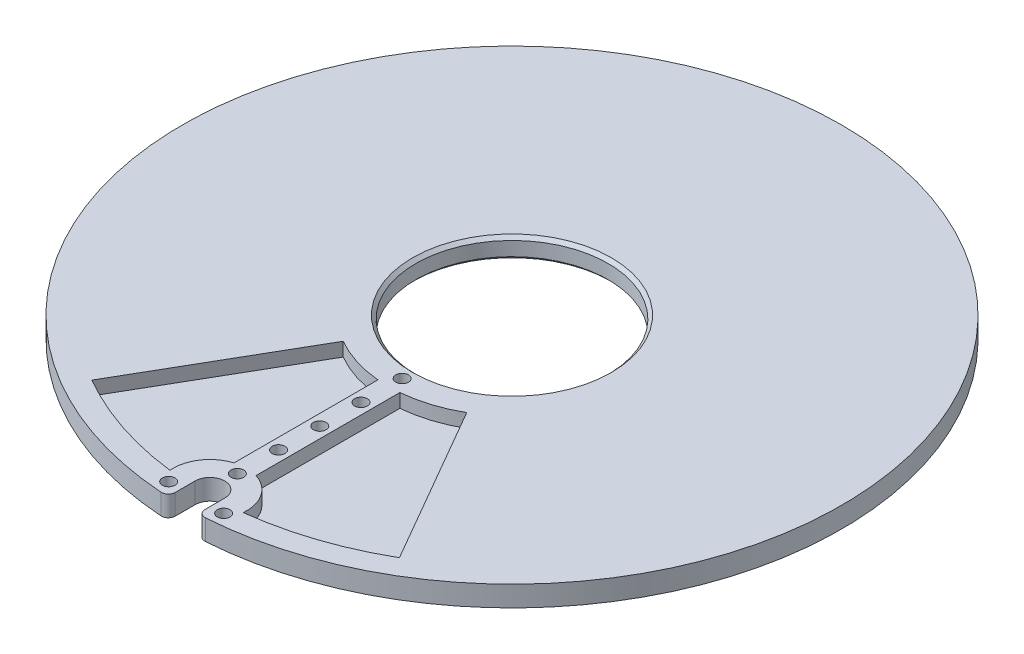
ISO-10303-21;
HEADER;
FILE_DESCRIPTION(('STEP AP214'),'2;1');
FILE_NAME('part.step','',(''),(''),'','','');
FILE_SCHEMA(('AUTOMOTIVE_DESIGN { 1 0 10303 214 1 1 1 1 }'));
ENDSEC;
DATA;
#1=APPLICATION_CONTEXT('core data for automotive mechanical design processes');
#2=APPLICATION_PROTOCOL_DEFINITION('international standard','automotive_design',2000,#1);
#3=PRODUCT_CONTEXT('',#1,'mechanical');
#4=PRODUCT('Part','Part','',(#3));
#5=PRODUCT_RELATED_PRODUCT_CATEGORY('part','',(#4));
#6=PRODUCT_DEFINITION_FORMATION('','',#4);
#7=PRODUCT_DEFINITION_CONTEXT('part definition',#1,'design');
#8=PRODUCT_DEFINITION('design','',#6,#7);
#9=PRODUCT_DEFINITION_SHAPE('','',#8);
#10=(LENGTH_UNIT() NAMED_UNIT(*) SI_UNIT(.MILLI.,.METRE.));
#11=(NAMED_UNIT(*) PLANE_ANGLE_UNIT() SI_UNIT($,.RADIAN.));
#12=(NAMED_UNIT(*) SI_UNIT($,.STERADIAN.) SOLID_ANGLE_UNIT());
#13=UNCERTAINTY_MEASURE_WITH_UNIT(LENGTH_MEASURE(1.E-05),#10,'distance_accuracy_value','');
#14=(GEOMETRIC_REPRESENTATION_CONTEXT(3) GLOBAL_UNCERTAINTY_ASSIGNED_CONTEXT((#13)) GLOBAL_UNIT_ASSIGNED_CONTEXT((#10,
#11,#12)) REPRESENTATION_CONTEXT('',''));
#15=CARTESIAN_POINT('',(0.,0.,0.));
#16=DIRECTION('',(0.,0.,1.));
#17=DIRECTION('',(1.,0.,0.));
#18=AXIS2_PLACEMENT_3D('',#15,#16,#17);
#19=CARTESIAN_POINT('',(0.,4.7625,0.));
#20=DIRECTION('',(0.,1.,0.));
#21=DIRECTION('',(0.,0.,1.));
#22=AXIS2_PLACEMENT_3D('',#19,#20,#21);
#23=PLANE('',#22);
#24=CARTESIAN_POINT('',(6.35,4.7625,73.025));
#25=DIRECTION('',(0.,1.,0.));
#26=DIRECTION('',(0.,0.,1.));
#27=AXIS2_PLACEMENT_3D('',#24,#25,#26);
#28=CIRCLE('',#27,1.47319999999999);
#29=CARTESIAN_POINT('',(6.35,4.7625,74.4982));
#30=VERTEX_POINT('',#29);
#31=EDGE_CURVE('E618',#30,#30,#28,.T.);
#32=ORIENTED_EDGE('',*,*,#31,.F.);
#33=EDGE_LOOP('',(#32));
#34=FACE_BOUND('',#33,.T.);
#35=CARTESIAN_POINT('',(-6.35,4.7625,73.025));
#36=DIRECTION('',(0.,1.,0.));
#37=DIRECTION('',(0.,0.,1.));
#38=AXIS2_PLACEMENT_3D('',#35,#36,#37);
#39=CIRCLE('',#38,1.47319999999999);
#40=CARTESIAN_POINT('',(-6.35,4.7625,74.4982));
#41=VERTEX_POINT('',#40);
#42=EDGE_CURVE('E622',#41,#41,#39,.T.);
#43=ORIENTED_EDGE('',*,*,#42,.F.);
#44=EDGE_LOOP('',(#43));
#45=FACE_BOUND('',#44,.T.);
#46=CARTESIAN_POINT('',(0.,4.7625,34.925));
#47=DIRECTION('',(0.,1.,0.));
#48=DIRECTION('',(0.,0.,1.));
#49=AXIS2_PLACEMENT_3D('',#46,#47,#48);
#50=CIRCLE('',#49,1.47319999999999);
#51=CARTESIAN_POINT('',(0.,4.7625,36.3982));
#52=VERTEX_POINT('',#51);
#53=EDGE_CURVE('E631',#52,#52,#50,.T.);
#54=ORIENTED_EDGE('',*,*,#53,.F.);
#55=EDGE_LOOP('',(#54));
#56=FACE_BOUND('',#55,.T.);
#57=CARTESIAN_POINT('',(0.,4.7625,44.45));
#58=DIRECTION('',(0.,1.,0.));
#59=DIRECTION('',(0.,0.,1.));
#60=AXIS2_PLACEMENT_3D('',#57,#58,#59);
#61=CIRCLE('',#60,1.47319999999999);
#62=CARTESIAN_POINT('',(0.,4.7625,45.9232));
#63=VERTEX_POINT('',#62);
#64=EDGE_CURVE('E637',#63,#63,#61,.T.);
#65=ORIENTED_EDGE('',*,*,#64,.F.);
#66=EDGE_LOOP('',(#65));
#67=FACE_BOUND('',#66,.T.);
#68=CARTESIAN_POINT('',(0.,4.7625,53.975));
#69=DIRECTION('',(0.,1.,0.));
#70=DIRECTION('',(0.,0.,1.));
#71=AXIS2_PLACEMENT_3D('',#68,#69,#70);
#72=CIRCLE('',#71,1.47319999999999);
#73=CARTESIAN_POINT('',(0.,4.7625,55.4482));
#74=VERTEX_POINT('',#73);
#75=EDGE_CURVE('E643',#74,#74,#72,.T.);
#76=ORIENTED_EDGE('',*,*,#75,.F.);
#77=EDGE_LOOP('',(#76));
#78=FACE_BOUND('',#77,.T.);
#79=CARTESIAN_POINT('',(0.,4.7625,63.5));
#80=DIRECTION('',(0.,1.,0.));
#81=DIRECTION('',(0.,0.,1.));
#82=AXIS2_PLACEMENT_3D('',#79,#80,#81);
#83=CIRCLE('',#82,1.47319999999999);
#84=CARTESIAN_POINT('',(0.,4.7625,64.9732));
#85=VERTEX_POINT('',#84);
#86=EDGE_CURVE('E645',#85,#85,#83,.T.);
#87=ORIENTED_EDGE('',*,*,#86,.F.);
#88=EDGE_LOOP('',(#87));
#89=FACE_BOUND('',#88,.T.);
#90=CARTESIAN_POINT('',(0.,4.7625,25.4));
#91=DIRECTION('',(0.,1.,0.));
#92=DIRECTION('',(0.,0.,1.));
#93=AXIS2_PLACEMENT_3D('',#90,#91,#92);
#94=CIRCLE('',#93,1.47319999999999);
#95=CARTESIAN_POINT('',(0.,4.7625,26.8732));
#96=VERTEX_POINT('',#95);
#97=EDGE_CURVE('E286',#96,#96,#94,.T.);
#98=ORIENTED_EDGE('',*,*,#97,.F.);
#99=EDGE_LOOP('',(#98));
#100=FACE_BOUND('',#99,.T.);
#101=CARTESIAN_POINT('',(0.,4.7625,0.));
#102=DIRECTION('',(0.,1.,0.));
#103=DIRECTION('',(0.,0.,-1.));
#104=AXIS2_PLACEMENT_3D('',#101,#102,#103);
#105=CIRCLE('',#104,71.12);
#106=CARTESIAN_POINT('',(8.47469762924318,4.7625,70.61327));
#107=VERTEX_POINT('',#106);
#108=CARTESIAN_POINT('',(35.5600000000001,4.7625,61.5917267171492));
#109=VERTEX_POINT('',#108);
#110=EDGE_CURVE('E299',#107,#109,#105,.T.);
#111=ORIENTED_EDGE('',*,*,#110,.F.);
#112=CARTESIAN_POINT('',(0.,4.7625,69.85));
#113=DIRECTION('',(0.,1.,0.));
#114=DIRECTION('',(0.,0.,1.));
#115=AXIS2_PLACEMENT_3D('',#112,#113,#114);
#116=CIRCLE('',#115,8.50900000000001);
#117=CARTESIAN_POINT('',(2.54,4.7625,61.7289482823959));
#118=VERTEX_POINT('',#117);
#119=EDGE_CURVE('E280',#107,#118,#116,.T.);
#120=ORIENTED_EDGE('',*,*,#119,.T.);
#121=DIRECTION('',(0.,0.,1.));
#122=VECTOR('',#121,1.);
#123=CARTESIAN_POINT('',(2.54,4.7625,28.461887235389));
#124=LINE('',#123,#122);
#125=CARTESIAN_POINT('',(2.54,4.7625,28.461887235389));
#126=VERTEX_POINT('',#125);
#127=EDGE_CURVE('E314',#126,#118,#124,.T.);
#128=ORIENTED_EDGE('',*,*,#127,.F.);
#129=CARTESIAN_POINT('',(0.,4.7625,0.));
#130=DIRECTION('',(0.,-1.,0.));
#131=DIRECTION('',(0.,0.,1.));
#132=AXIS2_PLACEMENT_3D('',#129,#130,#131);
#133=CIRCLE('',#132,28.575);
#134=CARTESIAN_POINT('',(14.2875,4.7625,24.7466759131403));
#135=VERTEX_POINT('',#134);
#136=EDGE_CURVE('E317',#135,#126,#133,.T.);
#137=ORIENTED_EDGE('',*,*,#136,.F.);
#138=DIRECTION('',(-0.500000000000001,0.,-0.866025403784438));
#139=VECTOR('',#138,1.);
#140=CARTESIAN_POINT('',(14.2875,4.7625,24.7466759131403));
#141=LINE('',#140,#139);
#142=EDGE_CURVE('E303',#109,#135,#141,.T.);
#143=ORIENTED_EDGE('',*,*,#142,.F.);
#144=EDGE_LOOP('',(#111,#120,#128,#137,#143));
#145=FACE_BOUND('',#144,.T.);
#146=DIRECTION('',(0.,0.,1.));
#147=VECTOR('',#146,1.);
#148=CARTESIAN_POINT('',(-2.54,4.7625,28.461887235389));
#149=LINE('',#148,#147);
#150=CARTESIAN_POINT('',(-2.54,4.7625,28.461887235389));
#151=VERTEX_POINT('',#150);
#152=CARTESIAN_POINT('',(-2.54,4.7625,61.7289482823959));
#153=VERTEX_POINT('',#152);
#154=EDGE_CURVE('E248',#151,#153,#149,.T.);
#155=ORIENTED_EDGE('',*,*,#154,.T.);
#156=CARTESIAN_POINT('',(-8.47469762924321,4.7625,70.61327));
#157=VERTEX_POINT('',#156);
#158=EDGE_CURVE('E278',#153,#157,#116,.T.);
#159=ORIENTED_EDGE('',*,*,#158,.T.);
#160=CARTESIAN_POINT('',(0.,4.7625,0.));
#161=DIRECTION('',(0.,-1.,0.));
#162=DIRECTION('',(0.,0.,-1.));
#163=AXIS2_PLACEMENT_3D('',#160,#161,#162);
#164=CIRCLE('',#163,71.12);
#165=CARTESIAN_POINT('',(-35.5600000000001,4.7625,61.5917267171492));
#166=VERTEX_POINT('',#165);
#167=EDGE_CURVE('E56',#157,#166,#164,.T.);
#168=ORIENTED_EDGE('',*,*,#167,.T.);
#169=DIRECTION('',(0.500000000000001,0.,-0.866025403784438));
#170=VECTOR('',#169,1.);
#171=CARTESIAN_POINT('',(-14.2875,4.7625,24.7466759131403));
#172=LINE('',#171,#170);
#173=CARTESIAN_POINT('',(-14.2875,4.7625,24.7466759131403));
#174=VERTEX_POINT('',#173);
#175=EDGE_CURVE('E253',#166,#174,#172,.T.);
#176=ORIENTED_EDGE('',*,*,#175,.T.);
#177=CARTESIAN_POINT('',(0.,4.7625,0.));
#178=DIRECTION('',(0.,1.,0.));
#179=DIRECTION('',(0.,0.,1.));
#180=AXIS2_PLACEMENT_3D('',#177,#178,#179);
#181=CIRCLE('',#180,28.575);
#182=EDGE_CURVE('E250',#174,#151,#181,.T.);
#183=ORIENTED_EDGE('',*,*,#182,.T.);
#184=EDGE_LOOP('',(#155,#159,#168,#176,#183));
#185=FACE_BOUND('',#184,.T.);
#186=DIRECTION('',(0.,0.,-1.));
#187=VECTOR('',#186,1.);
#188=CARTESIAN_POINT('',(3.42899999999999,4.7625,0.));
#189=LINE('',#188,#187);
#190=CARTESIAN_POINT('',(3.42899999999999,4.7625,74.4436692002752));
#191=VERTEX_POINT('',#190);
#192=CARTESIAN_POINT('',(3.42899999999999,4.7625,69.85));
#193=VERTEX_POINT('',#192);
#194=EDGE_CURVE('E166',#191,#193,#189,.T.);
#195=ORIENTED_EDGE('',*,*,#194,.F.);
#196=CARTESIAN_POINT('',(5.01649999999999,4.7625,74.4436692002752));
#197=DIRECTION('',(0.,1.,0.));
#198=DIRECTION('',(0.,0.,1.));
#199=AXIS2_PLACEMENT_3D('',#196,#197,#198);
#200=CIRCLE('',#199,1.5875);
#201=CARTESIAN_POINT('',(5.12323404255319,4.7625,76.0275770556002));
#202=VERTEX_POINT('',#201);
#203=EDGE_CURVE('E199',#191,#202,#200,.T.);
#204=ORIENTED_EDGE('',*,*,#203,.T.);
#205=CARTESIAN_POINT('',(0.,4.7625,0.));
#206=DIRECTION('',(0.,1.,0.));
#207=DIRECTION('',(0.,0.,1.));
#208=AXIS2_PLACEMENT_3D('',#205,#206,#207);
#209=CIRCLE('',#208,76.2);
#210=CARTESIAN_POINT('',(-5.1232340425532,4.7625,76.0275770556002));
#211=VERTEX_POINT('',#210);
#212=EDGE_CURVE('E237',#202,#211,#209,.T.);
#213=ORIENTED_EDGE('',*,*,#212,.T.);
#214=CARTESIAN_POINT('',(-5.0165,4.7625,74.4436692002752));
#215=DIRECTION('',(0.,1.,0.));
#216=DIRECTION('',(0.,0.,1.));
#217=AXIS2_PLACEMENT_3D('',#214,#215,#216);
#218=CIRCLE('',#217,1.5875);
#219=CARTESIAN_POINT('',(-3.42900000000001,4.7625,74.4436692002752));
#220=VERTEX_POINT('',#219);
#221=EDGE_CURVE('E163',#211,#220,#218,.T.);
#222=ORIENTED_EDGE('',*,*,#221,.T.);
#223=DIRECTION('',(0.,0.,1.));
#224=VECTOR('',#223,1.);
#225=CARTESIAN_POINT('',(-3.42900000000001,4.7625,0.));
#226=LINE('',#225,#224);
#227=CARTESIAN_POINT('',(-3.42900000000001,4.7625,69.85));
#228=VERTEX_POINT('',#227);
#229=EDGE_CURVE('E155',#228,#220,#226,.T.);
#230=ORIENTED_EDGE('',*,*,#229,.F.);
#231=CARTESIAN_POINT('',(0.,4.7625,69.85));
#232=DIRECTION('',(0.,1.,0.));
#233=DIRECTION('',(0.,0.,1.));
#234=AXIS2_PLACEMENT_3D('',#231,#232,#233);
#235=CIRCLE('',#234,3.429);
#236=EDGE_CURVE('E160',#193,#228,#235,.T.);
#237=ORIENTED_EDGE('',*,*,#236,.F.);
#238=EDGE_LOOP('',(#195,#204,#213,#222,#230,#237));
#239=FACE_BOUND('',#238,.T.);
#240=CARTESIAN_POINT('',(0.,4.7625,0.));
#241=DIRECTION('',(0.,1.,0.));
#242=DIRECTION('',(0.,0.,1.));
#243=AXIS2_PLACEMENT_3D('',#240,#241,#242);
#244=CIRCLE('',#243,22.9870000000001);
#245=CARTESIAN_POINT('',(0.,4.7625,22.9870000000001));
#246=VERTEX_POINT('',#245);
#247=EDGE_CURVE('E228',#246,#246,#244,.F.);
#248=ORIENTED_EDGE('',*,*,#247,.T.);
#249=EDGE_LOOP('',(#248));
#250=FACE_BOUND('',#249,.T.);
#251=ADVANCED_FACE('F39',(#34,#45,#56,#67,#78,#89,#100,#145,#185,#239,#250),#23,.T.);
#252=CARTESIAN_POINT('',(0.,4.7625,0.));
#253=DIRECTION('',(0.,-1.,0.));
#254=DIRECTION('',(0.,0.,-1.));
#255=AXIS2_PLACEMENT_3D('',#252,#253,#254);
#256=CYLINDRICAL_SURFACE('',#255,76.2);
#257=CARTESIAN_POINT('',(0.,0.,0.));
#258=DIRECTION('',(0.,1.,0.));
#259=DIRECTION('',(0.,0.,1.));
#260=AXIS2_PLACEMENT_3D('',#257,#258,#259);
#261=CIRCLE('',#260,76.2);
#262=CARTESIAN_POINT('',(5.12323404255319,0.,76.0275770556002));
#263=VERTEX_POINT('',#262);
#264=CARTESIAN_POINT('',(-5.1232340425532,0.,76.0275770556002));
#265=VERTEX_POINT('',#264);
#266=EDGE_CURVE('E238',#263,#265,#261,.T.);
#267=ORIENTED_EDGE('',*,*,#266,.T.);
#268=DIRECTION('',(0.,-1.,0.));
#269=VECTOR('',#268,1.);
#270=CARTESIAN_POINT('',(-5.1232340425532,4.7625,76.0275770556002));
#271=LINE('',#270,#269);
#272=EDGE_CURVE('E197',#265,#211,#271,.F.);
#273=ORIENTED_EDGE('',*,*,#272,.T.);
#274=ORIENTED_EDGE('',*,*,#212,.F.);
#275=DIRECTION('',(0.,-1.,0.));
#276=VECTOR('',#275,1.);
#277=CARTESIAN_POINT('',(5.12323404255318,4.7625,76.0275770556002));
#278=LINE('',#277,#276);
#279=EDGE_CURVE('E220',#202,#263,#278,.T.);
#280=ORIENTED_EDGE('',*,*,#279,.T.);
#281=EDGE_LOOP('',(#267,#273,#274,#280));
#282=FACE_BOUND('',#281,.T.);
#283=ADVANCED_FACE('F337',(#282),#256,.T.);
#284=CARTESIAN_POINT('',(0.,0.,0.));
#285=DIRECTION('',(0.,1.,0.));
#286=DIRECTION('',(0.,0.,1.));
#287=AXIS2_PLACEMENT_3D('',#284,#285,#286);
#288=PLANE('',#287);
#289=CARTESIAN_POINT('',(6.35,0.,73.025));
#290=DIRECTION('',(0.,1.,0.));
#291=DIRECTION('',(0.,0.,1.));
#292=AXIS2_PLACEMENT_3D('',#289,#290,#291);
#293=CIRCLE('',#292,1.47319999999999);
#294=CARTESIAN_POINT('',(6.35,0.,74.4982));
#295=VERTEX_POINT('',#294);
#296=EDGE_CURVE('E621',#295,#295,#293,.T.);
#297=ORIENTED_EDGE('',*,*,#296,.T.);
#298=EDGE_LOOP('',(#297));
#299=FACE_BOUND('',#298,.T.);
#300=CARTESIAN_POINT('',(-6.35,0.,73.025));
#301=DIRECTION('',(0.,1.,0.));
#302=DIRECTION('',(0.,0.,1.));
#303=AXIS2_PLACEMENT_3D('',#300,#301,#302);
#304=CIRCLE('',#303,1.47319999999999);
#305=CARTESIAN_POINT('',(-6.35,0.,74.4982));
#306=VERTEX_POINT('',#305);
#307=EDGE_CURVE('E625',#306,#306,#304,.T.);
#308=ORIENTED_EDGE('',*,*,#307,.T.);
#309=EDGE_LOOP('',(#308));
#310=FACE_BOUND('',#309,.T.);
#311=CARTESIAN_POINT('',(0.,0.,34.925));
#312=DIRECTION('',(0.,1.,0.));
#313=DIRECTION('',(0.,0.,1.));
#314=AXIS2_PLACEMENT_3D('',#311,#312,#313);
#315=CIRCLE('',#314,1.47319999999999);
#316=CARTESIAN_POINT('',(0.,0.,36.3982));
#317=VERTEX_POINT('',#316);
#318=EDGE_CURVE('E634',#317,#317,#315,.T.);
#319=ORIENTED_EDGE('',*,*,#318,.T.);
#320=EDGE_LOOP('',(#319));
#321=FACE_BOUND('',#320,.T.);
#322=CARTESIAN_POINT('',(0.,0.,44.45));
#323=DIRECTION('',(0.,1.,0.));
#324=DIRECTION('',(0.,0.,1.));
#325=AXIS2_PLACEMENT_3D('',#322,#323,#324);
#326=CIRCLE('',#325,1.47319999999999);
#327=CARTESIAN_POINT('',(0.,0.,45.9232));
#328=VERTEX_POINT('',#327);
#329=EDGE_CURVE('E640',#328,#328,#326,.T.);
#330=ORIENTED_EDGE('',*,*,#329,.T.);
#331=EDGE_LOOP('',(#330));
#332=FACE_BOUND('',#331,.T.);
#333=CARTESIAN_POINT('',(0.,0.,53.975));
#334=DIRECTION('',(0.,1.,0.));
#335=DIRECTION('',(0.,0.,1.));
#336=AXIS2_PLACEMENT_3D('',#333,#334,#335);
#337=CIRCLE('',#336,1.47319999999999);
#338=CARTESIAN_POINT('',(0.,0.,55.4482));
#339=VERTEX_POINT('',#338);
#340=EDGE_CURVE('E43',#339,#339,#337,.T.);
#341=ORIENTED_EDGE('',*,*,#340,.T.);
#342=EDGE_LOOP('',(#341));
#343=FACE_BOUND('',#342,.T.);
#344=CARTESIAN_POINT('',(0.,0.,63.5));
#345=DIRECTION('',(0.,1.,0.));
#346=DIRECTION('',(0.,0.,1.));
#347=AXIS2_PLACEMENT_3D('',#344,#345,#346);
#348=CIRCLE('',#347,1.47319999999999);
#349=CARTESIAN_POINT('',(0.,0.,64.9732));
#350=VERTEX_POINT('',#349);
#351=EDGE_CURVE('E647',#350,#350,#348,.T.);
#352=ORIENTED_EDGE('',*,*,#351,.T.);
#353=EDGE_LOOP('',(#352));
#354=FACE_BOUND('',#353,.T.);
#355=CARTESIAN_POINT('',(0.,0.,25.4));
#356=DIRECTION('',(0.,1.,0.));
#357=DIRECTION('',(0.,0.,1.));
#358=AXIS2_PLACEMENT_3D('',#355,#356,#357);
#359=CIRCLE('',#358,1.47319999999999);
#360=CARTESIAN_POINT('',(0.,0.,26.8732));
#361=VERTEX_POINT('',#360);
#362=EDGE_CURVE('E281',#361,#361,#359,.T.);
#363=ORIENTED_EDGE('',*,*,#362,.T.);
#364=EDGE_LOOP('',(#363));
#365=FACE_BOUND('',#364,.T.);
#366=CARTESIAN_POINT('',(0.,0.,0.));
#367=DIRECTION('',(0.,1.,0.));
#368=DIRECTION('',(0.,0.,1.));
#369=AXIS2_PLACEMENT_3D('',#366,#367,#368);
#370=CIRCLE('',#369,22.9869999999999);
#371=CARTESIAN_POINT('',(0.,0.,22.9869999999999));
#372=VERTEX_POINT('',#371);
#373=EDGE_CURVE('E223',#372,#372,#370,.T.);
#374=ORIENTED_EDGE('',*,*,#373,.T.);
#375=EDGE_LOOP('',(#374));
#376=FACE_BOUND('',#375,.T.);
#377=DIRECTION('',(0.,0.,1.));
#378=VECTOR('',#377,1.);
#379=CARTESIAN_POINT('',(-3.42900000000001,0.,76.454));
#380=LINE('',#379,#378);
#381=CARTESIAN_POINT('',(-3.42900000000001,0.,69.85));
#382=VERTEX_POINT('',#381);
#383=CARTESIAN_POINT('',(-3.42900000000001,0.,74.4436692002752));
#384=VERTEX_POINT('',#383);
#385=EDGE_CURVE('E172',#382,#384,#380,.T.);
#386=ORIENTED_EDGE('',*,*,#385,.T.);
#387=CARTESIAN_POINT('',(-5.0165,0.,74.4436692002752));
#388=DIRECTION('',(0.,1.,0.));
#389=DIRECTION('',(0.,0.,1.));
#390=AXIS2_PLACEMENT_3D('',#387,#388,#389);
#391=CIRCLE('',#390,1.5875);
#392=EDGE_CURVE('E205',#384,#265,#391,.F.);
#393=ORIENTED_EDGE('',*,*,#392,.T.);
#394=ORIENTED_EDGE('',*,*,#266,.F.);
#395=CARTESIAN_POINT('',(5.01649999999999,0.,74.4436692002752));
#396=DIRECTION('',(0.,1.,0.));
#397=DIRECTION('',(0.,0.,1.));
#398=AXIS2_PLACEMENT_3D('',#395,#396,#397);
#399=CIRCLE('',#398,1.5875);
#400=CARTESIAN_POINT('',(3.42899999999999,0.,74.4436692002752));
#401=VERTEX_POINT('',#400);
#402=EDGE_CURVE('E204',#263,#401,#399,.F.);
#403=ORIENTED_EDGE('',*,*,#402,.T.);
#404=DIRECTION('',(0.,0.,-1.));
#405=VECTOR('',#404,1.);
#406=CARTESIAN_POINT('',(3.42899999999999,0.,0.));
#407=LINE('',#406,#405);
#408=CARTESIAN_POINT('',(3.42899999999999,0.,69.85));
#409=VERTEX_POINT('',#408);
#410=EDGE_CURVE('E214',#401,#409,#407,.T.);
#411=ORIENTED_EDGE('',*,*,#410,.T.);
#412=CARTESIAN_POINT('',(0.,0.,69.85));
#413=DIRECTION('',(0.,1.,0.));
#414=DIRECTION('',(0.,0.,1.));
#415=AXIS2_PLACEMENT_3D('',#412,#413,#414);
#416=CIRCLE('',#415,3.429);
#417=EDGE_CURVE('E328',#409,#382,#416,.T.);
#418=ORIENTED_EDGE('',*,*,#417,.T.);
#419=EDGE_LOOP('',(#386,#393,#394,#403,#411,#418));
#420=FACE_BOUND('',#419,.T.);
#421=ADVANCED_FACE('F333',(#299,#310,#321,#332,#343,#354,#365,#376,#420),#288,.F.);
#422=CARTESIAN_POINT('',(0.,0.,0.));
#423=DIRECTION('',(0.,1.,0.));
#424=DIRECTION('',(0.,0.,1.));
#425=AXIS2_PLACEMENT_3D('',#422,#423,#424);
#426=CYLINDRICAL_SURFACE('',#425,22.225);
#427=CARTESIAN_POINT('',(0.,4.00049999999989,0.));
#428=DIRECTION('',(0.,1.,0.));
#429=DIRECTION('',(0.,0.,1.));
#430=AXIS2_PLACEMENT_3D('',#427,#428,#429);
#431=CIRCLE('',#430,22.225);
#432=CARTESIAN_POINT('',(0.,4.00049999999989,22.225));
#433=VERTEX_POINT('',#432);
#434=EDGE_CURVE('E231',#433,#433,#431,.T.);
#435=CARTESIAN_POINT('',(0.,0.761999999999936,0.));
#436=DIRECTION('',(0.,1.,0.));
#437=DIRECTION('',(0.,0.,1.));
#438=AXIS2_PLACEMENT_3D('',#435,#436,#437);
#439=CIRCLE('',#438,22.225);
#440=CARTESIAN_POINT('',(0.,0.761999999999936,22.225));
#441=VERTEX_POINT('',#440);
#442=EDGE_CURVE('E234',#441,#441,#439,.F.);
#443=CARTESIAN_POINT('',(0.,4.00049999999989,22.225));
#444=CARTESIAN_POINT('',(0.,3.96676562499989,22.225));
#445=CARTESIAN_POINT('',(0.,3.93303124999989,22.225));
#446=CARTESIAN_POINT('',(0.,3.86556249999989,22.225));
#447=CARTESIAN_POINT('',(0.,3.83182812499989,22.225));
#448=CARTESIAN_POINT('',(0.,3.76435937499989,22.225));
#449=CARTESIAN_POINT('',(0.,3.73062499999989,22.225));
#450=CARTESIAN_POINT('',(0.,3.6631562499999,22.225));
#451=CARTESIAN_POINT('',(0.,3.6294218749999,22.225));
#452=CARTESIAN_POINT('',(0.,3.5619531249999,22.225));
#453=CARTESIAN_POINT('',(0.,3.5282187499999,22.225));
#454=CARTESIAN_POINT('',(0.,3.4607499999999,22.225));
#455=CARTESIAN_POINT('',(0.,3.4270156249999,22.225));
#456=CARTESIAN_POINT('',(0.,3.3595468749999,22.225));
#457=CARTESIAN_POINT('',(0.,3.3258124999999,22.225));
#458=CARTESIAN_POINT('',(0.,3.2583437499999,22.225));
#459=CARTESIAN_POINT('',(0.,3.2246093749999,22.225));
#460=CARTESIAN_POINT('',(0.,3.1571406249999,22.225));
#461=CARTESIAN_POINT('',(0.,3.1234062499999,22.225));
#462=CARTESIAN_POINT('',(0.,3.0559374999999,22.225));
#463=CARTESIAN_POINT('',(0.,3.0222031249999,22.225));
#464=CARTESIAN_POINT('',(0.,2.95473437499991,22.225));
#465=CARTESIAN_POINT('',(0.,2.92099999999991,22.225));
#466=CARTESIAN_POINT('',(0.,2.85353124999991,22.225));
#467=CARTESIAN_POINT('',(0.,2.81979687499991,22.225));
#468=CARTESIAN_POINT('',(0.,2.75232812499991,22.225));
#469=CARTESIAN_POINT('',(0.,2.71859374999991,22.225));
#470=CARTESIAN_POINT('',(0.,2.65112499999991,22.225));
#471=CARTESIAN_POINT('',(0.,2.61739062499991,22.225));
#472=CARTESIAN_POINT('',(0.,2.54992187499991,22.225));
#473=CARTESIAN_POINT('',(0.,2.51618749999991,22.225));
#474=CARTESIAN_POINT('',(0.,2.44871874999991,22.225));
#475=CARTESIAN_POINT('',(0.,2.41498437499991,22.225));
#476=CARTESIAN_POINT('',(0.,2.34751562499991,22.225));
#477=CARTESIAN_POINT('',(0.,2.31378124999991,22.225));
#478=CARTESIAN_POINT('',(0.,2.24631249999992,22.225));
#479=CARTESIAN_POINT('',(0.,2.21257812499992,22.225));
#480=CARTESIAN_POINT('',(0.,2.14510937499992,22.225));
#481=CARTESIAN_POINT('',(0.,2.11137499999992,22.225));
#482=CARTESIAN_POINT('',(0.,2.04390624999992,22.225));
#483=CARTESIAN_POINT('',(0.,2.01017187499992,22.225));
#484=CARTESIAN_POINT('',(0.,1.94270312499992,22.225));
#485=CARTESIAN_POINT('',(0.,1.90896874999992,22.225));
#486=CARTESIAN_POINT('',(0.,1.84149999999992,22.225));
#487=CARTESIAN_POINT('',(0.,1.80776562499992,22.225));
#488=CARTESIAN_POINT('',(0.,1.74029687499992,22.225));
#489=CARTESIAN_POINT('',(0.,1.70656249999992,22.225));
#490=CARTESIAN_POINT('',(0.,1.63909374999992,22.225));
#491=CARTESIAN_POINT('',(0.,1.60535937499992,22.225));
#492=CARTESIAN_POINT('',(0.,1.53789062499993,22.225));
#493=CARTESIAN_POINT('',(0.,1.50415624999993,22.225));
#494=CARTESIAN_POINT('',(0.,1.43668749999993,22.225));
#495=CARTESIAN_POINT('',(0.,1.40295312499993,22.225));
#496=CARTESIAN_POINT('',(0.,1.33548437499993,22.225));
#497=CARTESIAN_POINT('',(0.,1.30174999999993,22.225));
#498=CARTESIAN_POINT('',(0.,1.23428124999993,22.225));
#499=CARTESIAN_POINT('',(0.,1.20054687499993,22.225));
#500=CARTESIAN_POINT('',(0.,1.13307812499993,22.225));
#501=CARTESIAN_POINT('',(0.,1.09934374999993,22.225));
#502=CARTESIAN_POINT('',(0.,1.03187499999993,22.225));
#503=CARTESIAN_POINT('',(0.,0.998140624999933,22.225));
#504=CARTESIAN_POINT('',(0.,0.930671874999934,22.225));
#505=CARTESIAN_POINT('',(0.,0.896937499999934,22.225));
#506=CARTESIAN_POINT('',(0.,0.829468749999935,22.225));
#507=CARTESIAN_POINT('',(0.,0.795734374999936,22.225));
#508=CARTESIAN_POINT('',(0.,0.761999999999936,22.225));
#509=B_SPLINE_CURVE_WITH_KNOTS('',3,(#443,#444,#445,#446,#447,#448,#449,#450,#451,#452,#453,
#454,#455,#456,#457,#458,#459,#460,#461,#462,#463,#464,#465,#466,#467,#468,#469,#470,#471,#472,
#473,#474,#475,#476,#477,#478,#479,#480,#481,#482,#483,#484,#485,#486,#487,#488,#489,#490,#491,
#492,#493,#494,#495,#496,#497,#498,#499,#500,#501,#502,#503,#504,#505,#506,#507,#508),
.UNSPECIFIED.,.F.,.F.,(4,2,2,2,2,2,2,2,2,2,2,2,2,2,2,2,2,2,2,2,2,2,2,2,2,2,2,2,2,2,2,2,4),(0.,
0.101203124999998,0.202406249999997,0.303609374999995,0.404812499999994,0.506015624999993,
0.607218749999991,0.708421874999989,0.809624999999988,0.910828124999987,1.01203124999999,
1.11323437499998,1.21443749999998,1.31564062499998,1.41684374999998,1.51804687499998,
1.61924999999998,1.72045312499998,1.82165624999997,1.92285937499997,2.02406249999997,
2.12526562499997,2.22646874999997,2.32767187499997,2.42887499999997,2.53007812499996,
2.63128124999996,2.73248437499996,2.83368749999996,2.93489062499996,3.03609374999996,
3.13729687499996,3.23849999999995),.UNSPECIFIED.);
#510=EDGE_CURVE('BSEAM344',#433,#441,#509,.T.);
#511=ORIENTED_EDGE('',*,*,#434,.T.);
#512=ORIENTED_EDGE('',*,*,#442,.T.);
#513=ORIENTED_EDGE('',*,*,#510,.T.);
#514=ORIENTED_EDGE('',*,*,#510,.F.);
#515=EDGE_LOOP('',(#511,#513,#512,#514));
#516=FACE_BOUND('',#515,.T.);
#517=ADVANCED_FACE('F344',(#516),#426,.F.);
#518=CARTESIAN_POINT('',(0.,1.5875,0.));
#519=DIRECTION('',(0.,1.,0.));
#520=DIRECTION('',(0.,0.,1.));
#521=AXIS2_PLACEMENT_3D('',#518,#519,#520);
#522=CYLINDRICAL_SURFACE('',#521,71.12);
#523=DIRECTION('',(0.,1.,0.));
#524=VECTOR('',#523,1.);
#525=CARTESIAN_POINT('',(-8.4746976292432,3.175,70.61327));
#526=LINE('',#525,#524);
#527=CARTESIAN_POINT('',(-8.47469762924316,1.5875,70.61327));
#528=VERTEX_POINT('',#527);
#529=EDGE_CURVE('E266',#528,#157,#526,.T.);
#530=ORIENTED_EDGE('',*,*,#529,.F.);
#531=CARTESIAN_POINT('',(0.,1.5875,0.));
#532=DIRECTION('',(0.,-1.,0.));
#533=DIRECTION('',(0.,0.,-1.));
#534=AXIS2_PLACEMENT_3D('',#531,#532,#533);
#535=CIRCLE('',#534,71.12);
#536=CARTESIAN_POINT('',(-35.5600000000001,1.5875,61.5917267171492));
#537=VERTEX_POINT('',#536);
#538=EDGE_CURVE('E192',#528,#537,#535,.T.);
#539=ORIENTED_EDGE('',*,*,#538,.T.);
#540=DIRECTION('',(0.,1.,0.));
#541=VECTOR('',#540,1.);
#542=CARTESIAN_POINT('',(-35.5600000000001,1.5875,61.5917267171492));
#543=LINE('',#542,#541);
#544=EDGE_CURVE('E240',#537,#166,#543,.T.);
#545=ORIENTED_EDGE('',*,*,#544,.T.);
#546=ORIENTED_EDGE('',*,*,#167,.F.);
#547=EDGE_LOOP('',(#530,#539,#545,#546));
#548=FACE_BOUND('',#547,.T.);
#549=ADVANCED_FACE('F265',(#548),#522,.F.);
#550=CARTESIAN_POINT('',(-14.2875,1.5875,24.7466759131403));
#551=DIRECTION('',(0.866025403784438,0.,0.500000000000001));
#552=DIRECTION('',(0.500000000000001,0.,-0.866025403784438));
#553=AXIS2_PLACEMENT_3D('',#550,#551,#552);
#554=PLANE('',#553);
#555=ORIENTED_EDGE('',*,*,#175,.F.);
#556=ORIENTED_EDGE('',*,*,#544,.F.);
#557=DIRECTION('',(0.500000000000001,0.,-0.866025403784438));
#558=VECTOR('',#557,1.);
#559=CARTESIAN_POINT('',(-14.2875,1.5875,24.7466759131403));
#560=LINE('',#559,#558);
#561=CARTESIAN_POINT('',(-14.2875,1.5875,24.7466759131403));
#562=VERTEX_POINT('',#561);
#563=EDGE_CURVE('E259',#537,#562,#560,.T.);
#564=ORIENTED_EDGE('',*,*,#563,.T.);
#565=DIRECTION('',(0.,1.,0.));
#566=VECTOR('',#565,1.);
#567=CARTESIAN_POINT('',(-14.2875,1.5875,24.7466759131403));
#568=LINE('',#567,#566);
#569=EDGE_CURVE('E243',#562,#174,#568,.T.);
#570=ORIENTED_EDGE('',*,*,#569,.T.);
#571=EDGE_LOOP('',(#555,#556,#564,#570));
#572=FACE_BOUND('',#571,.T.);
#573=ADVANCED_FACE('F273',(#572),#554,.T.);
#574=CARTESIAN_POINT('',(0.,1.5875,0.));
#575=DIRECTION('',(0.,1.,0.));
#576=DIRECTION('',(0.,0.,1.));
#577=AXIS2_PLACEMENT_3D('',#574,#575,#576);
#578=CYLINDRICAL_SURFACE('',#577,28.575);
#579=ORIENTED_EDGE('',*,*,#182,.F.);
#580=ORIENTED_EDGE('',*,*,#569,.F.);
#581=CARTESIAN_POINT('',(0.,1.5875,0.));
#582=DIRECTION('',(0.,1.,0.));
#583=DIRECTION('',(0.,0.,1.));
#584=AXIS2_PLACEMENT_3D('',#581,#582,#583);
#585=CIRCLE('',#584,28.575);
#586=CARTESIAN_POINT('',(-2.54,1.5875,28.461887235389));
#587=VERTEX_POINT('',#586);
#588=EDGE_CURVE('E258',#562,#587,#585,.T.);
#589=ORIENTED_EDGE('',*,*,#588,.T.);
#590=DIRECTION('',(0.,1.,0.));
#591=VECTOR('',#590,1.);
#592=CARTESIAN_POINT('',(-2.54,1.5875,28.461887235389));
#593=LINE('',#592,#591);
#594=EDGE_CURVE('E245',#587,#151,#593,.T.);
#595=ORIENTED_EDGE('',*,*,#594,.T.);
#596=EDGE_LOOP('',(#579,#580,#589,#595));
#597=FACE_BOUND('',#596,.T.);
#598=ADVANCED_FACE('F375',(#597),#578,.T.);
#599=CARTESIAN_POINT('',(-2.54,1.5875,28.461887235389));
#600=DIRECTION('',(-1.,0.,0.));
#601=DIRECTION('',(0.,0.,1.));
#602=AXIS2_PLACEMENT_3D('',#599,#600,#601);
#603=PLANE('',#602);
#604=DIRECTION('',(0.,1.,0.));
#605=VECTOR('',#604,1.);
#606=CARTESIAN_POINT('',(-2.54,-19.890215524977,61.7289482823959));
#607=LINE('',#606,#605);
#608=CARTESIAN_POINT('',(-2.54,1.5875,61.7289482823959));
#609=VERTEX_POINT('',#608);
#610=EDGE_CURVE('E64',#153,#609,#607,.F.);
#611=ORIENTED_EDGE('',*,*,#610,.F.);
#612=ORIENTED_EDGE('',*,*,#154,.F.);
#613=ORIENTED_EDGE('',*,*,#594,.F.);
#614=DIRECTION('',(0.,0.,1.));
#615=VECTOR('',#614,1.);
#616=CARTESIAN_POINT('',(-2.54,1.5875,28.461887235389));
#617=LINE('',#616,#615);
#618=EDGE_CURVE('E247',#587,#609,#617,.T.);
#619=ORIENTED_EDGE('',*,*,#618,.T.);
#620=EDGE_LOOP('',(#611,#612,#613,#619));
#621=FACE_BOUND('',#620,.T.);
#622=ADVANCED_FACE('F372',(#621),#603,.T.);
#623=CARTESIAN_POINT('',(0.,1.5875,0.));
#624=DIRECTION('',(0.,-1.,0.));
#625=DIRECTION('',(0.,0.,-1.));
#626=AXIS2_PLACEMENT_3D('',#623,#624,#625);
#627=PLANE('',#626);
#628=ORIENTED_EDGE('',*,*,#538,.F.);
#629=CARTESIAN_POINT('',(0.,1.5875,69.85));
#630=DIRECTION('',(0.,-1.,0.));
#631=DIRECTION('',(0.,0.,-1.));
#632=AXIS2_PLACEMENT_3D('',#629,#630,#631);
#633=CIRCLE('',#632,8.50900000000001);
#634=EDGE_CURVE('E284',#609,#528,#633,.F.);
#635=ORIENTED_EDGE('',*,*,#634,.F.);
#636=ORIENTED_EDGE('',*,*,#618,.F.);
#637=ORIENTED_EDGE('',*,*,#588,.F.);
#638=ORIENTED_EDGE('',*,*,#563,.F.);
#639=EDGE_LOOP('',(#628,#635,#636,#637,#638));
#640=FACE_BOUND('',#639,.T.);
#641=ADVANCED_FACE('F270',(#640),#627,.F.);
#642=CARTESIAN_POINT('',(0.,4.00049999999989,0.));
#643=DIRECTION('',(0.,1.,0.));
#644=DIRECTION('',(0.,0.,1.));
#645=AXIS2_PLACEMENT_3D('',#642,#643,#644);
#646=CONICAL_SURFACE('',#645,22.225,0.785398163397453);
#647=ORIENTED_EDGE('',*,*,#247,.F.);
#648=EDGE_LOOP('',(#647));
#649=FACE_BOUND('',#648,.T.);
#650=ORIENTED_EDGE('',*,*,#434,.F.);
#651=EDGE_LOOP('',(#650));
#652=FACE_BOUND('',#651,.T.);
#653=ADVANCED_FACE('F350',(#649,#652),#646,.F.);
#654=CARTESIAN_POINT('',(0.,0.,0.));
#655=DIRECTION('',(0.,-1.,0.));
#656=DIRECTION('',(0.,0.,-1.));
#657=AXIS2_PLACEMENT_3D('',#654,#655,#656);
#658=CONICAL_SURFACE('',#657,22.9869999999999,0.785398163397439);
#659=ORIENTED_EDGE('',*,*,#442,.F.);
#660=EDGE_LOOP('',(#659));
#661=FACE_BOUND('',#660,.T.);
#662=ORIENTED_EDGE('',*,*,#373,.F.);
#663=EDGE_LOOP('',(#662));
#664=FACE_BOUND('',#663,.T.);
#665=ADVANCED_FACE('F353',(#661,#664),#658,.F.);
#666=CARTESIAN_POINT('',(-3.42900000000001,0.,76.454));
#667=DIRECTION('',(-1.,0.,0.));
#668=DIRECTION('',(0.,0.,1.));
#669=AXIS2_PLACEMENT_3D('',#666,#667,#668);
#670=PLANE('',#669);
#671=DIRECTION('',(0.,1.,0.));
#672=VECTOR('',#671,1.);
#673=CARTESIAN_POINT('',(-3.42900000000001,0.,69.85));
#674=LINE('',#673,#672);
#675=EDGE_CURVE('E169',#382,#228,#674,.T.);
#676=ORIENTED_EDGE('',*,*,#675,.T.);
#677=ORIENTED_EDGE('',*,*,#229,.T.);
#678=DIRECTION('',(0.,-1.,0.));
#679=VECTOR('',#678,1.);
#680=CARTESIAN_POINT('',(-3.42900000000001,0.,74.4436692002752));
#681=LINE('',#680,#679);
#682=EDGE_CURVE('E202',#220,#384,#681,.T.);
#683=ORIENTED_EDGE('',*,*,#682,.T.);
#684=ORIENTED_EDGE('',*,*,#385,.F.);
#685=EDGE_LOOP('',(#676,#677,#683,#684));
#686=FACE_BOUND('',#685,.T.);
#687=ADVANCED_FACE('F170',(#686),#670,.F.);
#688=CARTESIAN_POINT('',(0.,0.,69.85));
#689=DIRECTION('',(0.,1.,0.));
#690=DIRECTION('',(0.,0.,1.));
#691=AXIS2_PLACEMENT_3D('',#688,#689,#690);
#692=CYLINDRICAL_SURFACE('',#691,3.429);
#693=ORIENTED_EDGE('',*,*,#236,.T.);
#694=ORIENTED_EDGE('',*,*,#675,.F.);
#695=ORIENTED_EDGE('',*,*,#417,.F.);
#696=DIRECTION('',(0.,1.,0.));
#697=VECTOR('',#696,1.);
#698=CARTESIAN_POINT('',(3.42899999999999,0.,69.85));
#699=LINE('',#698,#697);
#700=EDGE_CURVE('E176',#409,#193,#699,.T.);
#701=ORIENTED_EDGE('',*,*,#700,.T.);
#702=EDGE_LOOP('',(#693,#694,#695,#701));
#703=FACE_BOUND('',#702,.T.);
#704=ADVANCED_FACE('F179',(#703),#692,.F.);
#705=CARTESIAN_POINT('',(3.42899999999999,0.,76.454));
#706=DIRECTION('',(1.,0.,0.));
#707=DIRECTION('',(0.,0.,-1.));
#708=AXIS2_PLACEMENT_3D('',#705,#706,#707);
#709=PLANE('',#708);
#710=DIRECTION('',(0.,-1.,0.));
#711=VECTOR('',#710,1.);
#712=CARTESIAN_POINT('',(3.42899999999999,0.,74.4436692002752));
#713=LINE('',#712,#711);
#714=EDGE_CURVE('E48',#401,#191,#713,.F.);
#715=ORIENTED_EDGE('',*,*,#714,.T.);
#716=ORIENTED_EDGE('',*,*,#194,.T.);
#717=ORIENTED_EDGE('',*,*,#700,.F.);
#718=ORIENTED_EDGE('',*,*,#410,.F.);
#719=EDGE_LOOP('',(#715,#716,#717,#718));
#720=FACE_BOUND('',#719,.T.);
#721=ADVANCED_FACE('F213',(#720),#709,.F.);
#722=CARTESIAN_POINT('',(-5.0165,4.7625,74.4436692002752));
#723=DIRECTION('',(0.,-1.,0.));
#724=DIRECTION('',(0.,0.,-1.));
#725=AXIS2_PLACEMENT_3D('',#722,#723,#724);
#726=CYLINDRICAL_SURFACE('',#725,1.5875);
#727=ORIENTED_EDGE('',*,*,#392,.F.);
#728=ORIENTED_EDGE('',*,*,#682,.F.);
#729=ORIENTED_EDGE('',*,*,#221,.F.);
#730=ORIENTED_EDGE('',*,*,#272,.F.);
#731=EDGE_LOOP('',(#727,#728,#729,#730));
#732=FACE_BOUND('',#731,.T.);
#733=ADVANCED_FACE('F336',(#732),#726,.T.);
#734=CARTESIAN_POINT('',(5.01649999999999,4.7625,74.4436692002752));
#735=DIRECTION('',(0.,-1.,0.));
#736=DIRECTION('',(0.,0.,-1.));
#737=AXIS2_PLACEMENT_3D('',#734,#735,#736);
#738=CYLINDRICAL_SURFACE('',#737,1.5875);
#739=ORIENTED_EDGE('',*,*,#203,.F.);
#740=ORIENTED_EDGE('',*,*,#714,.F.);
#741=ORIENTED_EDGE('',*,*,#402,.F.);
#742=ORIENTED_EDGE('',*,*,#279,.F.);
#743=EDGE_LOOP('',(#739,#740,#741,#742));
#744=FACE_BOUND('',#743,.T.);
#745=ADVANCED_FACE('F41',(#744),#738,.T.);
#746=CARTESIAN_POINT('',(2.54,1.5875,28.461887235389));
#747=DIRECTION('',(-1.,0.,0.));
#748=DIRECTION('',(0.,0.,1.));
#749=AXIS2_PLACEMENT_3D('',#746,#747,#748);
#750=PLANE('',#749);
#751=ORIENTED_EDGE('',*,*,#127,.T.);
#752=DIRECTION('',(0.,1.,0.));
#753=VECTOR('',#752,1.);
#754=CARTESIAN_POINT('',(2.54,-19.890215524977,61.7289482823959));
#755=LINE('',#754,#753);
#756=CARTESIAN_POINT('',(2.54,1.5875,61.7289482823959));
#757=VERTEX_POINT('',#756);
#758=EDGE_CURVE('E294',#118,#757,#755,.F.);
#759=ORIENTED_EDGE('',*,*,#758,.T.);
#760=DIRECTION('',(0.,0.,1.));
#761=VECTOR('',#760,1.);
#762=CARTESIAN_POINT('',(2.54,1.5875,28.461887235389));
#763=LINE('',#762,#761);
#764=CARTESIAN_POINT('',(2.54,1.5875,28.461887235389));
#765=VERTEX_POINT('',#764);
#766=EDGE_CURVE('E302',#765,#757,#763,.T.);
#767=ORIENTED_EDGE('',*,*,#766,.F.);
#768=DIRECTION('',(0.,1.,0.));
#769=VECTOR('',#768,1.);
#770=CARTESIAN_POINT('',(2.54,1.5875,28.461887235389));
#771=LINE('',#770,#769);
#772=EDGE_CURVE('E326',#765,#126,#771,.T.);
#773=ORIENTED_EDGE('',*,*,#772,.T.);
#774=EDGE_LOOP('',(#751,#759,#767,#773));
#775=FACE_BOUND('',#774,.T.);
#776=ADVANCED_FACE('F362',(#775),#750,.F.);
#777=CARTESIAN_POINT('',(0.,1.5875,0.));
#778=DIRECTION('',(0.,1.,0.));
#779=DIRECTION('',(0.,0.,1.));
#780=AXIS2_PLACEMENT_3D('',#777,#778,#779);
#781=CYLINDRICAL_SURFACE('',#780,71.12);
#782=CARTESIAN_POINT('',(0.,1.5875,0.));
#783=DIRECTION('',(0.,1.,0.));
#784=DIRECTION('',(0.,0.,-1.));
#785=AXIS2_PLACEMENT_3D('',#782,#783,#784);
#786=CIRCLE('',#785,71.12);
#787=CARTESIAN_POINT('',(8.47469762924318,1.5875,70.61327));
#788=VERTEX_POINT('',#787);
#789=CARTESIAN_POINT('',(35.5600000000001,1.5875,61.5917267171492));
#790=VERTEX_POINT('',#789);
#791=EDGE_CURVE('E300',#788,#790,#786,.T.);
#792=ORIENTED_EDGE('',*,*,#791,.F.);
#793=DIRECTION('',(0.,1.,0.));
#794=VECTOR('',#793,1.);
#795=CARTESIAN_POINT('',(8.47469762924318,3.175,70.61327));
#796=LINE('',#795,#794);
#797=EDGE_CURVE('E291',#788,#107,#796,.T.);
#798=ORIENTED_EDGE('',*,*,#797,.T.);
#799=ORIENTED_EDGE('',*,*,#110,.T.);
#800=DIRECTION('',(0.,1.,0.));
#801=VECTOR('',#800,1.);
#802=CARTESIAN_POINT('',(35.5600000000001,1.5875,61.5917267171492));
#803=LINE('',#802,#801);
#804=EDGE_CURVE('E312',#790,#109,#803,.T.);
#805=ORIENTED_EDGE('',*,*,#804,.F.);
#806=EDGE_LOOP('',(#792,#798,#799,#805));
#807=FACE_BOUND('',#806,.T.);
#808=ADVANCED_FACE('F460',(#807),#781,.F.);
#809=CARTESIAN_POINT('',(0.,1.5875,0.));
#810=DIRECTION('',(0.,-1.,0.));
#811=DIRECTION('',(0.,0.,-1.));
#812=AXIS2_PLACEMENT_3D('',#809,#810,#811);
#813=PLANE('',#812);
#814=ORIENTED_EDGE('',*,*,#766,.T.);
#815=CARTESIAN_POINT('',(0.,1.5875,69.85));
#816=DIRECTION('',(0.,-1.,0.));
#817=DIRECTION('',(0.,0.,-1.));
#818=AXIS2_PLACEMENT_3D('',#815,#816,#817);
#819=CIRCLE('',#818,8.50900000000001);
#820=EDGE_CURVE('E11',#757,#788,#819,.T.);
#821=ORIENTED_EDGE('',*,*,#820,.T.);
#822=ORIENTED_EDGE('',*,*,#791,.T.);
#823=DIRECTION('',(-0.500000000000001,0.,-0.866025403784438));
#824=VECTOR('',#823,1.);
#825=CARTESIAN_POINT('',(14.2875,1.5875,24.7466759131403));
#826=LINE('',#825,#824);
#827=CARTESIAN_POINT('',(14.2875,1.5875,24.7466759131403));
#828=VERTEX_POINT('',#827);
#829=EDGE_CURVE('E309',#790,#828,#826,.T.);
#830=ORIENTED_EDGE('',*,*,#829,.T.);
#831=CARTESIAN_POINT('',(0.,1.5875,0.));
#832=DIRECTION('',(0.,-1.,0.));
#833=DIRECTION('',(0.,0.,1.));
#834=AXIS2_PLACEMENT_3D('',#831,#832,#833);
#835=CIRCLE('',#834,28.575);
#836=EDGE_CURVE('E306',#828,#765,#835,.T.);
#837=ORIENTED_EDGE('',*,*,#836,.T.);
#838=EDGE_LOOP('',(#814,#821,#822,#830,#837));
#839=FACE_BOUND('',#838,.T.);
#840=ADVANCED_FACE('F470',(#839),#813,.F.);
#841=CARTESIAN_POINT('',(0.,1.5875,0.));
#842=DIRECTION('',(0.,1.,0.));
#843=DIRECTION('',(0.,0.,1.));
#844=AXIS2_PLACEMENT_3D('',#841,#842,#843);
#845=CYLINDRICAL_SURFACE('',#844,28.575);
#846=ORIENTED_EDGE('',*,*,#136,.T.);
#847=ORIENTED_EDGE('',*,*,#772,.F.);
#848=ORIENTED_EDGE('',*,*,#836,.F.);
#849=DIRECTION('',(0.,1.,0.));
#850=VECTOR('',#849,1.);
#851=CARTESIAN_POINT('',(14.2875,1.5875,24.7466759131403));
#852=LINE('',#851,#850);
#853=EDGE_CURVE('E324',#828,#135,#852,.T.);
#854=ORIENTED_EDGE('',*,*,#853,.T.);
#855=EDGE_LOOP('',(#846,#847,#848,#854));
#856=FACE_BOUND('',#855,.T.);
#857=ADVANCED_FACE('F480',(#856),#845,.T.);
#858=CARTESIAN_POINT('',(14.2875,1.5875,24.7466759131403));
#859=DIRECTION('',(0.866025403784438,0.,-0.500000000000001));
#860=DIRECTION('',(-0.500000000000001,0.,-0.866025403784438));
#861=AXIS2_PLACEMENT_3D('',#858,#859,#860);
#862=PLANE('',#861);
#863=ORIENTED_EDGE('',*,*,#142,.T.);
#864=ORIENTED_EDGE('',*,*,#853,.F.);
#865=ORIENTED_EDGE('',*,*,#829,.F.);
#866=ORIENTED_EDGE('',*,*,#804,.T.);
#867=EDGE_LOOP('',(#863,#864,#865,#866));
#868=FACE_BOUND('',#867,.T.);
#869=ADVANCED_FACE('F493',(#868),#862,.F.);
#870=CARTESIAN_POINT('',(0.,-19.890215524977,69.85));
#871=DIRECTION('',(0.,1.,0.));
#872=DIRECTION('',(0.,0.,1.));
#873=AXIS2_PLACEMENT_3D('',#870,#871,#872);
#874=CYLINDRICAL_SURFACE('',#873,8.50900000000001);
#875=ORIENTED_EDGE('',*,*,#758,.F.);
#876=ORIENTED_EDGE('',*,*,#119,.F.);
#877=ORIENTED_EDGE('',*,*,#797,.F.);
#878=ORIENTED_EDGE('',*,*,#820,.F.);
#879=EDGE_LOOP('',(#875,#876,#877,#878));
#880=FACE_BOUND('',#879,.T.);
#881=ADVANCED_FACE('F488',(#880),#874,.T.);
#882=ORIENTED_EDGE('',*,*,#634,.T.);
#883=ORIENTED_EDGE('',*,*,#529,.T.);
#884=ORIENTED_EDGE('',*,*,#158,.F.);
#885=ORIENTED_EDGE('',*,*,#610,.T.);
#886=EDGE_LOOP('',(#882,#883,#884,#885));
#887=FACE_BOUND('',#886,.T.);
#888=ADVANCED_FACE('F492',(#887),#874,.T.);
#889=CARTESIAN_POINT('',(0.,4.7625,25.4));
#890=DIRECTION('',(0.,1.,0.));
#891=DIRECTION('',(0.,0.,1.));
#892=AXIS2_PLACEMENT_3D('',#889,#890,#891);
#893=CYLINDRICAL_SURFACE('',#892,1.47319999999999);
#894=ORIENTED_EDGE('',*,*,#97,.T.);
#895=EDGE_LOOP('',(#894));
#896=FACE_BOUND('',#895,.T.);
#897=ORIENTED_EDGE('',*,*,#362,.F.);
#898=EDGE_LOOP('',(#897));
#899=FACE_BOUND('',#898,.T.);
#900=ADVANCED_FACE('F504',(#896,#899),#893,.F.);
#901=CARTESIAN_POINT('',(0.,4.7625,63.5));
#902=DIRECTION('',(0.,1.,0.));
#903=DIRECTION('',(0.,0.,1.));
#904=AXIS2_PLACEMENT_3D('',#901,#902,#903);
#905=CYLINDRICAL_SURFACE('',#904,1.47319999999999);
#906=ORIENTED_EDGE('',*,*,#86,.T.);
#907=EDGE_LOOP('',(#906));
#908=FACE_BOUND('',#907,.T.);
#909=ORIENTED_EDGE('',*,*,#351,.F.);
#910=EDGE_LOOP('',(#909));
#911=FACE_BOUND('',#910,.T.);
#912=ADVANCED_FACE('F512',(#908,#911),#905,.F.);
#913=CARTESIAN_POINT('',(0.,4.7625,53.975));
#914=DIRECTION('',(0.,1.,0.));
#915=DIRECTION('',(0.,0.,1.));
#916=AXIS2_PLACEMENT_3D('',#913,#914,#915);
#917=CYLINDRICAL_SURFACE('',#916,1.47319999999999);
#918=ORIENTED_EDGE('',*,*,#75,.T.);
#919=EDGE_LOOP('',(#918));
#920=FACE_BOUND('',#919,.T.);
#921=ORIENTED_EDGE('',*,*,#340,.F.);
#922=EDGE_LOOP('',(#921));
#923=FACE_BOUND('',#922,.T.);
#924=ADVANCED_FACE('F522',(#920,#923),#917,.F.);
#925=CARTESIAN_POINT('',(0.,4.7625,44.45));
#926=DIRECTION('',(0.,1.,0.));
#927=DIRECTION('',(0.,0.,1.));
#928=AXIS2_PLACEMENT_3D('',#925,#926,#927);
#929=CYLINDRICAL_SURFACE('',#928,1.47319999999999);
#930=ORIENTED_EDGE('',*,*,#64,.T.);
#931=EDGE_LOOP('',(#930));
#932=FACE_BOUND('',#931,.T.);
#933=ORIENTED_EDGE('',*,*,#329,.F.);
#934=EDGE_LOOP('',(#933));
#935=FACE_BOUND('',#934,.T.);
#936=ADVANCED_FACE('F532',(#932,#935),#929,.F.);
#937=CARTESIAN_POINT('',(0.,4.7625,34.925));
#938=DIRECTION('',(0.,1.,0.));
#939=DIRECTION('',(0.,0.,1.));
#940=AXIS2_PLACEMENT_3D('',#937,#938,#939);
#941=CYLINDRICAL_SURFACE('',#940,1.47319999999999);
#942=ORIENTED_EDGE('',*,*,#53,.T.);
#943=EDGE_LOOP('',(#942));
#944=FACE_BOUND('',#943,.T.);
#945=ORIENTED_EDGE('',*,*,#318,.F.);
#946=EDGE_LOOP('',(#945));
#947=FACE_BOUND('',#946,.T.);
#948=ADVANCED_FACE('F542',(#944,#947),#941,.F.);
#949=CARTESIAN_POINT('',(-6.35,4.7625,73.025));
#950=DIRECTION('',(0.,1.,0.));
#951=DIRECTION('',(0.,0.,1.));
#952=AXIS2_PLACEMENT_3D('',#949,#950,#951);
#953=CYLINDRICAL_SURFACE('',#952,1.47319999999999);
#954=ORIENTED_EDGE('',*,*,#42,.T.);
#955=EDGE_LOOP('',(#954));
#956=FACE_BOUND('',#955,.T.);
#957=ORIENTED_EDGE('',*,*,#307,.F.);
#958=EDGE_LOOP('',(#957));
#959=FACE_BOUND('',#958,.T.);
#960=ADVANCED_FACE('F552',(#956,#959),#953,.F.);
#961=CARTESIAN_POINT('',(6.35,4.7625,73.025));
#962=DIRECTION('',(0.,1.,0.));
#963=DIRECTION('',(0.,0.,1.));
#964=AXIS2_PLACEMENT_3D('',#961,#962,#963);
#965=CYLINDRICAL_SURFACE('',#964,1.47319999999999);
#966=ORIENTED_EDGE('',*,*,#31,.T.);
#967=EDGE_LOOP('',(#966));
#968=FACE_BOUND('',#967,.T.);
#969=ORIENTED_EDGE('',*,*,#296,.F.);
#970=EDGE_LOOP('',(#969));
#971=FACE_BOUND('',#970,.T.);
#972=ADVANCED_FACE('F575',(#968,#971),#965,.F.);
#973=CLOSED_SHELL('',(#251,#283,#421,#517,#549,#573,#598,#622,#641,#653,#665,#687,#704,#721,
#733,#745,#776,#808,#840,#857,#869,#881,#888,#900,#912,#924,#936,#948,#960,#972));
#974=MANIFOLD_SOLID_BREP('B2',#973);
#975=ADVANCED_BREP_SHAPE_REPRESENTATION('',(#18,#974),#14);
#976=SHAPE_DEFINITION_REPRESENTATION(#9,#975);
ENDSEC;
END-ISO-10303-21;
